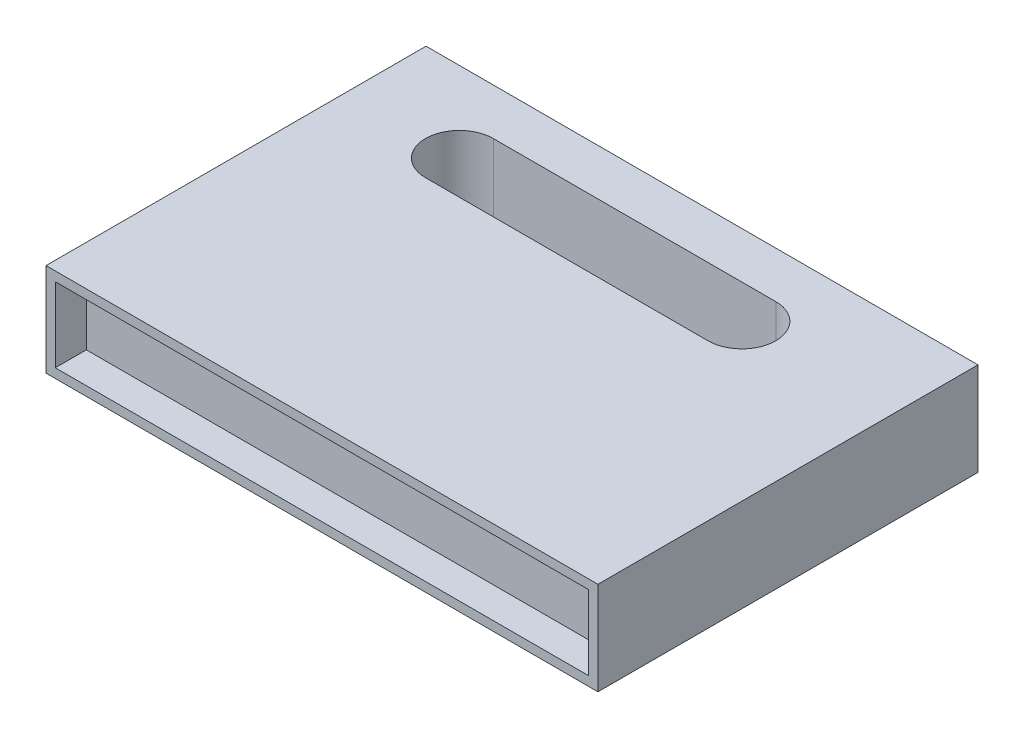
ISO-10303-21;
HEADER;
FILE_DESCRIPTION(('STEP AP214'),'2;1');
FILE_NAME('part.step','',(''),(''),'','','');
FILE_SCHEMA(('AUTOMOTIVE_DESIGN { 1 0 10303 214 1 1 1 1 }'));
ENDSEC;
DATA;
#1=APPLICATION_CONTEXT('core data for automotive mechanical design processes');
#2=APPLICATION_PROTOCOL_DEFINITION('international standard','automotive_design',2000,#1);
#3=PRODUCT_CONTEXT('',#1,'mechanical');
#4=PRODUCT('Part','Part','',(#3));
#5=PRODUCT_RELATED_PRODUCT_CATEGORY('part','',(#4));
#6=PRODUCT_DEFINITION_FORMATION('','',#4);
#7=PRODUCT_DEFINITION_CONTEXT('part definition',#1,'design');
#8=PRODUCT_DEFINITION('design','',#6,#7);
#9=PRODUCT_DEFINITION_SHAPE('','',#8);
#10=(LENGTH_UNIT() NAMED_UNIT(*) SI_UNIT(.MILLI.,.METRE.));
#11=(NAMED_UNIT(*) PLANE_ANGLE_UNIT() SI_UNIT($,.RADIAN.));
#12=(NAMED_UNIT(*) SI_UNIT($,.STERADIAN.) SOLID_ANGLE_UNIT());
#13=UNCERTAINTY_MEASURE_WITH_UNIT(LENGTH_MEASURE(1.E-05),#10,'distance_accuracy_value','');
#14=(GEOMETRIC_REPRESENTATION_CONTEXT(3) GLOBAL_UNCERTAINTY_ASSIGNED_CONTEXT((#13)) GLOBAL_UNIT_ASSIGNED_CONTEXT((#10,
#11,#12)) REPRESENTATION_CONTEXT('',''));
#15=CARTESIAN_POINT('',(0.,0.,0.));
#16=DIRECTION('',(0.,0.,1.));
#17=DIRECTION('',(1.,0.,0.));
#18=AXIS2_PLACEMENT_3D('',#15,#16,#17);
#19=CARTESIAN_POINT('',(88.8654509861638,30.,61.188082871758));
#20=DIRECTION('',(-1.,0.,0.));
#21=DIRECTION('',(0.,0.,1.));
#22=AXIS2_PLACEMENT_3D('',#19,#20,#21);
#23=PLANE('',#22);
#24=DIRECTION('',(0.,0.,-1.));
#25=VECTOR('',#24,1.);
#26=CARTESIAN_POINT('',(88.8654509861638,0.,61.188082871758));
#27=LINE('',#26,#25);
#28=CARTESIAN_POINT('',(88.8654509861638,0.,61.188082871758));
#29=VERTEX_POINT('',#28);
#30=CARTESIAN_POINT('',(88.8654509861638,0.,-61.188082871758));
#31=VERTEX_POINT('',#30);
#32=EDGE_CURVE('E185',#29,#31,#27,.T.);
#33=ORIENTED_EDGE('',*,*,#32,.T.);
#34=DIRECTION('',(0.,-1.,0.));
#35=VECTOR('',#34,1.);
#36=CARTESIAN_POINT('',(88.8654509861638,30.,-61.188082871758));
#37=LINE('',#36,#35);
#38=CARTESIAN_POINT('',(88.8654509861638,30.,-61.188082871758));
#39=VERTEX_POINT('',#38);
#40=EDGE_CURVE('E11',#39,#31,#37,.T.);
#41=ORIENTED_EDGE('',*,*,#40,.F.);
#42=DIRECTION('',(0.,0.,-1.));
#43=VECTOR('',#42,1.);
#44=CARTESIAN_POINT('',(88.8654509861638,30.,61.188082871758));
#45=LINE('',#44,#43);
#46=CARTESIAN_POINT('',(88.8654509861638,30.,61.188082871758));
#47=VERTEX_POINT('',#46);
#48=EDGE_CURVE('E192',#47,#39,#45,.T.);
#49=ORIENTED_EDGE('',*,*,#48,.F.);
#50=DIRECTION('',(0.,-1.,0.));
#51=VECTOR('',#50,1.);
#52=CARTESIAN_POINT('',(88.8654509861638,30.,61.188082871758));
#53=LINE('',#52,#51);
#54=EDGE_CURVE('E202',#47,#29,#53,.T.);
#55=ORIENTED_EDGE('',*,*,#54,.T.);
#56=EDGE_LOOP('',(#33,#41,#49,#55));
#57=FACE_BOUND('',#56,.T.);
#58=ADVANCED_FACE('F35',(#57),#23,.F.);
#59=CARTESIAN_POINT('',(-88.8654509861638,30.,-61.188082871758));
#60=DIRECTION('',(0.,0.,1.));
#61=DIRECTION('',(1.,0.,0.));
#62=AXIS2_PLACEMENT_3D('',#59,#60,#61);
#63=PLANE('',#62);
#64=DIRECTION('',(-1.,0.,0.));
#65=VECTOR('',#64,1.);
#66=CARTESIAN_POINT('',(-88.8654509861638,0.,-61.188082871758));
#67=LINE('',#66,#65);
#68=CARTESIAN_POINT('',(-88.8654509861638,0.,-61.188082871758));
#69=VERTEX_POINT('',#68);
#70=EDGE_CURVE('E205',#31,#69,#67,.T.);
#71=ORIENTED_EDGE('',*,*,#70,.T.);
#72=DIRECTION('',(0.,-1.,0.));
#73=VECTOR('',#72,1.);
#74=CARTESIAN_POINT('',(-88.8654509861638,30.,-61.188082871758));
#75=LINE('',#74,#73);
#76=CARTESIAN_POINT('',(-88.8654509861638,30.,-61.188082871758));
#77=VERTEX_POINT('',#76);
#78=EDGE_CURVE('E42',#77,#69,#75,.T.);
#79=ORIENTED_EDGE('',*,*,#78,.F.);
#80=DIRECTION('',(-1.,0.,0.));
#81=VECTOR('',#80,1.);
#82=CARTESIAN_POINT('',(-88.8654509861638,30.,-61.188082871758));
#83=LINE('',#82,#81);
#84=EDGE_CURVE('E195',#39,#77,#83,.T.);
#85=ORIENTED_EDGE('',*,*,#84,.F.);
#86=ORIENTED_EDGE('',*,*,#40,.T.);
#87=EDGE_LOOP('',(#71,#79,#85,#86));
#88=FACE_BOUND('',#87,.T.);
#89=ADVANCED_FACE('F233',(#88),#63,.F.);
#90=CARTESIAN_POINT('',(-88.8654509861638,30.,61.188082871758));
#91=DIRECTION('',(1.,0.,0.));
#92=DIRECTION('',(0.,0.,-1.));
#93=AXIS2_PLACEMENT_3D('',#90,#91,#92);
#94=PLANE('',#93);
#95=DIRECTION('',(0.,0.,1.));
#96=VECTOR('',#95,1.);
#97=CARTESIAN_POINT('',(-88.8654509861638,0.,61.188082871758));
#98=LINE('',#97,#96);
#99=CARTESIAN_POINT('',(-88.8654509861638,0.,61.188082871758));
#100=VERTEX_POINT('',#99);
#101=EDGE_CURVE('E207',#69,#100,#98,.T.);
#102=ORIENTED_EDGE('',*,*,#101,.T.);
#103=DIRECTION('',(0.,-1.,0.));
#104=VECTOR('',#103,1.);
#105=CARTESIAN_POINT('',(-88.8654509861638,30.,61.188082871758));
#106=LINE('',#105,#104);
#107=CARTESIAN_POINT('',(-88.8654509861638,30.,61.188082871758));
#108=VERTEX_POINT('',#107);
#109=EDGE_CURVE('E212',#108,#100,#106,.T.);
#110=ORIENTED_EDGE('',*,*,#109,.F.);
#111=DIRECTION('',(0.,0.,1.));
#112=VECTOR('',#111,1.);
#113=CARTESIAN_POINT('',(-88.8654509861638,30.,61.188082871758));
#114=LINE('',#113,#112);
#115=EDGE_CURVE('E198',#77,#108,#114,.T.);
#116=ORIENTED_EDGE('',*,*,#115,.F.);
#117=ORIENTED_EDGE('',*,*,#78,.T.);
#118=EDGE_LOOP('',(#102,#110,#116,#117));
#119=FACE_BOUND('',#118,.T.);
#120=ADVANCED_FACE('F219',(#119),#94,.F.);
#121=CARTESIAN_POINT('',(-88.8654509861638,30.,61.188082871758));
#122=DIRECTION('',(0.,0.,-1.));
#123=DIRECTION('',(-1.,0.,0.));
#124=AXIS2_PLACEMENT_3D('',#121,#122,#123);
#125=PLANE('',#124);
#126=DIRECTION('',(1.,0.,0.));
#127=VECTOR('',#126,1.);
#128=CARTESIAN_POINT('',(-85.8654509861638,3.,61.188082871758));
#129=LINE('',#128,#127);
#130=CARTESIAN_POINT('',(-85.8654509861638,3.,61.188082871758));
#131=VERTEX_POINT('',#130);
#132=CARTESIAN_POINT('',(85.8654509861638,3.,61.188082871758));
#133=VERTEX_POINT('',#132);
#134=EDGE_CURVE('E175',#131,#133,#129,.T.);
#135=ORIENTED_EDGE('',*,*,#134,.F.);
#136=DIRECTION('',(0.,-1.,0.));
#137=VECTOR('',#136,1.);
#138=CARTESIAN_POINT('',(-85.8654509861638,27.,61.188082871758));
#139=LINE('',#138,#137);
#140=CARTESIAN_POINT('',(-85.8654509861638,27.,61.188082871758));
#141=VERTEX_POINT('',#140);
#142=EDGE_CURVE('E156',#141,#131,#139,.T.);
#143=ORIENTED_EDGE('',*,*,#142,.F.);
#144=DIRECTION('',(-1.,0.,0.));
#145=VECTOR('',#144,1.);
#146=CARTESIAN_POINT('',(85.8654509861638,27.,61.188082871758));
#147=LINE('',#146,#145);
#148=CARTESIAN_POINT('',(85.8654509861638,27.,61.188082871758));
#149=VERTEX_POINT('',#148);
#150=EDGE_CURVE('E164',#149,#141,#147,.T.);
#151=ORIENTED_EDGE('',*,*,#150,.F.);
#152=DIRECTION('',(0.,1.,0.));
#153=VECTOR('',#152,1.);
#154=CARTESIAN_POINT('',(85.8654509861638,3.,61.188082871758));
#155=LINE('',#154,#153);
#156=EDGE_CURVE('E178',#133,#149,#155,.T.);
#157=ORIENTED_EDGE('',*,*,#156,.F.);
#158=EDGE_LOOP('',(#135,#143,#151,#157));
#159=FACE_BOUND('',#158,.T.);
#160=DIRECTION('',(1.,0.,0.));
#161=VECTOR('',#160,1.);
#162=CARTESIAN_POINT('',(-88.8654509861638,0.,61.188082871758));
#163=LINE('',#162,#161);
#164=EDGE_CURVE('E196',#100,#29,#163,.T.);
#165=ORIENTED_EDGE('',*,*,#164,.T.);
#166=ORIENTED_EDGE('',*,*,#54,.F.);
#167=DIRECTION('',(1.,0.,0.));
#168=VECTOR('',#167,1.);
#169=CARTESIAN_POINT('',(-88.8654509861638,30.,61.188082871758));
#170=LINE('',#169,#168);
#171=EDGE_CURVE('E200',#108,#47,#170,.T.);
#172=ORIENTED_EDGE('',*,*,#171,.F.);
#173=ORIENTED_EDGE('',*,*,#109,.T.);
#174=EDGE_LOOP('',(#165,#166,#172,#173));
#175=FACE_BOUND('',#174,.T.);
#176=ADVANCED_FACE('F226',(#159,#175),#125,.F.);
#177=CARTESIAN_POINT('',(0.,30.,0.));
#178=DIRECTION('',(0.,-1.,0.));
#179=DIRECTION('',(0.,0.,-1.));
#180=AXIS2_PLACEMENT_3D('',#177,#178,#179);
#181=PLANE('',#180);
#182=DIRECTION('',(1.,0.,0.));
#183=VECTOR('',#182,1.);
#184=CARTESIAN_POINT('',(-52.2914341109817,30.,-24.4218236232608));
#185=LINE('',#184,#183);
#186=CARTESIAN_POINT('',(-52.2914341109817,30.,-24.4218236232608));
#187=VERTEX_POINT('',#186);
#188=CARTESIAN_POINT('',(38.6918303678326,30.,-24.4218236232608));
#189=VERTEX_POINT('',#188);
#190=EDGE_CURVE('E150',#187,#189,#185,.T.);
#191=ORIENTED_EDGE('',*,*,#190,.F.);
#192=CARTESIAN_POINT('',(-52.2914341109817,30.,-35.3398153607185));
#193=DIRECTION('',(0.,1.,0.));
#194=DIRECTION('',(0.,0.,1.));
#195=AXIS2_PLACEMENT_3D('',#192,#193,#194);
#196=CIRCLE('',#195,10.9179917374577);
#197=CARTESIAN_POINT('',(-52.2914341109817,30.,-46.2578070981763));
#198=VERTEX_POINT('',#197);
#199=EDGE_CURVE('E49',#198,#187,#196,.T.);
#200=ORIENTED_EDGE('',*,*,#199,.F.);
#201=DIRECTION('',(-1.,0.,0.));
#202=VECTOR('',#201,1.);
#203=CARTESIAN_POINT('',(-52.2914341109817,30.,-46.2578070981763));
#204=LINE('',#203,#202);
#205=CARTESIAN_POINT('',(38.6918303678326,30.,-46.2578070981763));
#206=VERTEX_POINT('',#205);
#207=EDGE_CURVE('E141',#206,#198,#204,.T.);
#208=ORIENTED_EDGE('',*,*,#207,.F.);
#209=CARTESIAN_POINT('',(38.6918303678326,30.,-35.3398153607185));
#210=DIRECTION('',(0.,1.,0.));
#211=DIRECTION('',(0.,0.,1.));
#212=AXIS2_PLACEMENT_3D('',#209,#210,#211);
#213=CIRCLE('',#212,10.9179917374577);
#214=EDGE_CURVE('E144',#189,#206,#213,.T.);
#215=ORIENTED_EDGE('',*,*,#214,.F.);
#216=EDGE_LOOP('',(#191,#200,#208,#215));
#217=FACE_BOUND('',#216,.T.);
#218=ORIENTED_EDGE('',*,*,#48,.T.);
#219=ORIENTED_EDGE('',*,*,#84,.T.);
#220=ORIENTED_EDGE('',*,*,#115,.T.);
#221=ORIENTED_EDGE('',*,*,#171,.T.);
#222=EDGE_LOOP('',(#218,#219,#220,#221));
#223=FACE_BOUND('',#222,.T.);
#224=ADVANCED_FACE('F232',(#217,#223),#181,.F.);
#225=CARTESIAN_POINT('',(0.,0.,0.));
#226=DIRECTION('',(0.,-1.,0.));
#227=DIRECTION('',(0.,0.,-1.));
#228=AXIS2_PLACEMENT_3D('',#225,#226,#227);
#229=PLANE('',#228);
#230=CARTESIAN_POINT('',(-52.2914341109817,0.,-35.3398153607185));
#231=DIRECTION('',(0.,1.,0.));
#232=DIRECTION('',(0.,0.,1.));
#233=AXIS2_PLACEMENT_3D('',#230,#231,#232);
#234=CIRCLE('',#233,10.9179917374577);
#235=CARTESIAN_POINT('',(-52.2914341109817,0.,-46.2578070981763));
#236=VERTEX_POINT('',#235);
#237=CARTESIAN_POINT('',(-52.2914341109817,0.,-24.4218236232608));
#238=VERTEX_POINT('',#237);
#239=EDGE_CURVE('E125',#236,#238,#234,.T.);
#240=ORIENTED_EDGE('',*,*,#239,.T.);
#241=DIRECTION('',(1.,0.,0.));
#242=VECTOR('',#241,1.);
#243=CARTESIAN_POINT('',(-52.2914341109817,0.,-24.4218236232608));
#244=LINE('',#243,#242);
#245=CARTESIAN_POINT('',(38.6918303678326,0.,-24.4218236232608));
#246=VERTEX_POINT('',#245);
#247=EDGE_CURVE('E134',#238,#246,#244,.T.);
#248=ORIENTED_EDGE('',*,*,#247,.T.);
#249=CARTESIAN_POINT('',(38.6918303678326,0.,-35.3398153607185));
#250=DIRECTION('',(0.,1.,0.));
#251=DIRECTION('',(0.,0.,1.));
#252=AXIS2_PLACEMENT_3D('',#249,#250,#251);
#253=CIRCLE('',#252,10.9179917374577);
#254=CARTESIAN_POINT('',(38.6918303678326,0.,-46.2578070981763));
#255=VERTEX_POINT('',#254);
#256=EDGE_CURVE('E57',#246,#255,#253,.T.);
#257=ORIENTED_EDGE('',*,*,#256,.T.);
#258=DIRECTION('',(-1.,0.,0.));
#259=VECTOR('',#258,1.);
#260=CARTESIAN_POINT('',(-52.2914341109817,0.,-46.2578070981763));
#261=LINE('',#260,#259);
#262=EDGE_CURVE('E131',#255,#236,#261,.T.);
#263=ORIENTED_EDGE('',*,*,#262,.T.);
#264=EDGE_LOOP('',(#240,#248,#257,#263));
#265=FACE_BOUND('',#264,.T.);
#266=ORIENTED_EDGE('',*,*,#32,.F.);
#267=ORIENTED_EDGE('',*,*,#164,.F.);
#268=ORIENTED_EDGE('',*,*,#101,.F.);
#269=ORIENTED_EDGE('',*,*,#70,.F.);
#270=EDGE_LOOP('',(#266,#267,#268,#269));
#271=FACE_BOUND('',#270,.T.);
#272=ADVANCED_FACE('F138',(#265,#271),#229,.T.);
#273=CARTESIAN_POINT('',(-85.8654509861638,27.,51.188082871758));
#274=DIRECTION('',(-1.,0.,0.));
#275=DIRECTION('',(0.,0.,1.));
#276=AXIS2_PLACEMENT_3D('',#273,#274,#275);
#277=PLANE('',#276);
#278=ORIENTED_EDGE('',*,*,#142,.T.);
#279=DIRECTION('',(0.,0.,1.));
#280=VECTOR('',#279,1.);
#281=CARTESIAN_POINT('',(-85.8654509861638,3.,51.188082871758));
#282=LINE('',#281,#280);
#283=CARTESIAN_POINT('',(-85.8654509861638,3.,51.188082871758));
#284=VERTEX_POINT('',#283);
#285=EDGE_CURVE('E173',#284,#131,#282,.T.);
#286=ORIENTED_EDGE('',*,*,#285,.F.);
#287=DIRECTION('',(0.,-1.,0.));
#288=VECTOR('',#287,1.);
#289=CARTESIAN_POINT('',(-85.8654509861638,27.,51.188082871758));
#290=LINE('',#289,#288);
#291=CARTESIAN_POINT('',(-85.8654509861638,27.,51.188082871758));
#292=VERTEX_POINT('',#291);
#293=EDGE_CURVE('E160',#292,#284,#290,.T.);
#294=ORIENTED_EDGE('',*,*,#293,.F.);
#295=DIRECTION('',(0.,0.,1.));
#296=VECTOR('',#295,1.);
#297=CARTESIAN_POINT('',(-85.8654509861638,27.,51.188082871758));
#298=LINE('',#297,#296);
#299=EDGE_CURVE('E183',#292,#141,#298,.T.);
#300=ORIENTED_EDGE('',*,*,#299,.T.);
#301=EDGE_LOOP('',(#278,#286,#294,#300));
#302=FACE_BOUND('',#301,.T.);
#303=ADVANCED_FACE('F246',(#302),#277,.F.);
#304=CARTESIAN_POINT('',(85.8654509861638,27.,51.188082871758));
#305=DIRECTION('',(0.,1.,0.));
#306=DIRECTION('',(0.,0.,1.));
#307=AXIS2_PLACEMENT_3D('',#304,#305,#306);
#308=PLANE('',#307);
#309=ORIENTED_EDGE('',*,*,#150,.T.);
#310=ORIENTED_EDGE('',*,*,#299,.F.);
#311=DIRECTION('',(-1.,0.,0.));
#312=VECTOR('',#311,1.);
#313=CARTESIAN_POINT('',(85.8654509861638,27.,51.188082871758));
#314=LINE('',#313,#312);
#315=CARTESIAN_POINT('',(85.8654509861638,27.,51.188082871758));
#316=VERTEX_POINT('',#315);
#317=EDGE_CURVE('E170',#316,#292,#314,.T.);
#318=ORIENTED_EDGE('',*,*,#317,.F.);
#319=DIRECTION('',(0.,0.,1.));
#320=VECTOR('',#319,1.);
#321=CARTESIAN_POINT('',(85.8654509861638,27.,51.188082871758));
#322=LINE('',#321,#320);
#323=EDGE_CURVE('E186',#316,#149,#322,.T.);
#324=ORIENTED_EDGE('',*,*,#323,.T.);
#325=EDGE_LOOP('',(#309,#310,#318,#324));
#326=FACE_BOUND('',#325,.T.);
#327=ADVANCED_FACE('F252',(#326),#308,.F.);
#328=CARTESIAN_POINT('',(85.8654509861638,3.,51.188082871758));
#329=DIRECTION('',(1.,0.,0.));
#330=DIRECTION('',(0.,0.,-1.));
#331=AXIS2_PLACEMENT_3D('',#328,#329,#330);
#332=PLANE('',#331);
#333=ORIENTED_EDGE('',*,*,#156,.T.);
#334=ORIENTED_EDGE('',*,*,#323,.F.);
#335=DIRECTION('',(0.,1.,0.));
#336=VECTOR('',#335,1.);
#337=CARTESIAN_POINT('',(85.8654509861638,3.,51.188082871758));
#338=LINE('',#337,#336);
#339=CARTESIAN_POINT('',(85.8654509861638,3.,51.188082871758));
#340=VERTEX_POINT('',#339);
#341=EDGE_CURVE('E167',#340,#316,#338,.T.);
#342=ORIENTED_EDGE('',*,*,#341,.F.);
#343=DIRECTION('',(0.,0.,1.));
#344=VECTOR('',#343,1.);
#345=CARTESIAN_POINT('',(85.8654509861638,3.,51.188082871758));
#346=LINE('',#345,#344);
#347=EDGE_CURVE('E188',#340,#133,#346,.T.);
#348=ORIENTED_EDGE('',*,*,#347,.T.);
#349=EDGE_LOOP('',(#333,#334,#342,#348));
#350=FACE_BOUND('',#349,.T.);
#351=ADVANCED_FACE('F258',(#350),#332,.F.);
#352=CARTESIAN_POINT('',(-85.8654509861638,3.,51.188082871758));
#353=DIRECTION('',(0.,-1.,0.));
#354=DIRECTION('',(0.,0.,-1.));
#355=AXIS2_PLACEMENT_3D('',#352,#353,#354);
#356=PLANE('',#355);
#357=ORIENTED_EDGE('',*,*,#134,.T.);
#358=ORIENTED_EDGE('',*,*,#347,.F.);
#359=DIRECTION('',(1.,0.,0.));
#360=VECTOR('',#359,1.);
#361=CARTESIAN_POINT('',(-85.8654509861638,3.,51.188082871758));
#362=LINE('',#361,#360);
#363=EDGE_CURVE('E163',#284,#340,#362,.T.);
#364=ORIENTED_EDGE('',*,*,#363,.F.);
#365=ORIENTED_EDGE('',*,*,#285,.T.);
#366=EDGE_LOOP('',(#357,#358,#364,#365));
#367=FACE_BOUND('',#366,.T.);
#368=ADVANCED_FACE('F254',(#367),#356,.F.);
#369=CARTESIAN_POINT('',(0.,0.,51.188082871758));
#370=DIRECTION('',(0.,0.,1.));
#371=DIRECTION('',(1.,0.,0.));
#372=AXIS2_PLACEMENT_3D('',#369,#370,#371);
#373=PLANE('',#372);
#374=ORIENTED_EDGE('',*,*,#293,.T.);
#375=ORIENTED_EDGE('',*,*,#363,.T.);
#376=ORIENTED_EDGE('',*,*,#341,.T.);
#377=ORIENTED_EDGE('',*,*,#317,.T.);
#378=EDGE_LOOP('',(#374,#375,#376,#377));
#379=FACE_BOUND('',#378,.T.);
#380=ADVANCED_FACE('F257',(#379),#373,.T.);
#381=CARTESIAN_POINT('',(-52.2914341109817,0.,-35.3398153607185));
#382=DIRECTION('',(0.,1.,0.));
#383=DIRECTION('',(0.,0.,1.));
#384=AXIS2_PLACEMENT_3D('',#381,#382,#383);
#385=CYLINDRICAL_SURFACE('',#384,10.9179917374577);
#386=ORIENTED_EDGE('',*,*,#199,.T.);
#387=DIRECTION('',(0.,1.,0.));
#388=VECTOR('',#387,1.);
#389=CARTESIAN_POINT('',(-52.2914341109817,0.,-24.4218236232608));
#390=LINE('',#389,#388);
#391=EDGE_CURVE('E121',#238,#187,#390,.T.);
#392=ORIENTED_EDGE('',*,*,#391,.F.);
#393=ORIENTED_EDGE('',*,*,#239,.F.);
#394=DIRECTION('',(0.,1.,0.));
#395=VECTOR('',#394,1.);
#396=CARTESIAN_POINT('',(-52.2914341109817,0.,-46.2578070981763));
#397=LINE('',#396,#395);
#398=EDGE_CURVE('E154',#236,#198,#397,.T.);
#399=ORIENTED_EDGE('',*,*,#398,.T.);
#400=EDGE_LOOP('',(#386,#392,#393,#399));
#401=FACE_BOUND('',#400,.T.);
#402=ADVANCED_FACE('F123',(#401),#385,.F.);
#403=CARTESIAN_POINT('',(-52.2914341109817,0.,-46.2578070981763));
#404=DIRECTION('',(0.,0.,-1.));
#405=DIRECTION('',(-1.,0.,0.));
#406=AXIS2_PLACEMENT_3D('',#403,#404,#405);
#407=PLANE('',#406);
#408=ORIENTED_EDGE('',*,*,#207,.T.);
#409=ORIENTED_EDGE('',*,*,#398,.F.);
#410=ORIENTED_EDGE('',*,*,#262,.F.);
#411=DIRECTION('',(0.,1.,0.));
#412=VECTOR('',#411,1.);
#413=CARTESIAN_POINT('',(38.6918303678326,0.,-46.2578070981763));
#414=LINE('',#413,#412);
#415=EDGE_CURVE('E157',#255,#206,#414,.T.);
#416=ORIENTED_EDGE('',*,*,#415,.T.);
#417=EDGE_LOOP('',(#408,#409,#410,#416));
#418=FACE_BOUND('',#417,.T.);
#419=ADVANCED_FACE('F271',(#418),#407,.F.);
#420=CARTESIAN_POINT('',(38.6918303678326,0.,-35.3398153607185));
#421=DIRECTION('',(0.,1.,0.));
#422=DIRECTION('',(0.,0.,1.));
#423=AXIS2_PLACEMENT_3D('',#420,#421,#422);
#424=CYLINDRICAL_SURFACE('',#423,10.9179917374577);
#425=ORIENTED_EDGE('',*,*,#214,.T.);
#426=ORIENTED_EDGE('',*,*,#415,.F.);
#427=ORIENTED_EDGE('',*,*,#256,.F.);
#428=DIRECTION('',(0.,1.,0.));
#429=VECTOR('',#428,1.);
#430=CARTESIAN_POINT('',(38.6918303678326,0.,-24.4218236232608));
#431=LINE('',#430,#429);
#432=EDGE_CURVE('E130',#246,#189,#431,.T.);
#433=ORIENTED_EDGE('',*,*,#432,.T.);
#434=EDGE_LOOP('',(#425,#426,#427,#433));
#435=FACE_BOUND('',#434,.T.);
#436=ADVANCED_FACE('F274',(#435),#424,.F.);
#437=CARTESIAN_POINT('',(-52.2914341109817,0.,-24.4218236232608));
#438=DIRECTION('',(0.,0.,1.));
#439=DIRECTION('',(1.,0.,0.));
#440=AXIS2_PLACEMENT_3D('',#437,#438,#439);
#441=PLANE('',#440);
#442=ORIENTED_EDGE('',*,*,#190,.T.);
#443=ORIENTED_EDGE('',*,*,#432,.F.);
#444=ORIENTED_EDGE('',*,*,#247,.F.);
#445=ORIENTED_EDGE('',*,*,#391,.T.);
#446=EDGE_LOOP('',(#442,#443,#444,#445));
#447=FACE_BOUND('',#446,.T.);
#448=ADVANCED_FACE('F135',(#447),#441,.F.);
#449=CLOSED_SHELL('',(#58,#89,#120,#176,#224,#272,#303,#327,#351,#368,#380,#402,#419,#436,#448));
#450=MANIFOLD_SOLID_BREP('B2',#449);
#451=ADVANCED_BREP_SHAPE_REPRESENTATION('',(#18,#450),#14);
#452=SHAPE_DEFINITION_REPRESENTATION(#9,#451);
ENDSEC;
END-ISO-10303-21;
